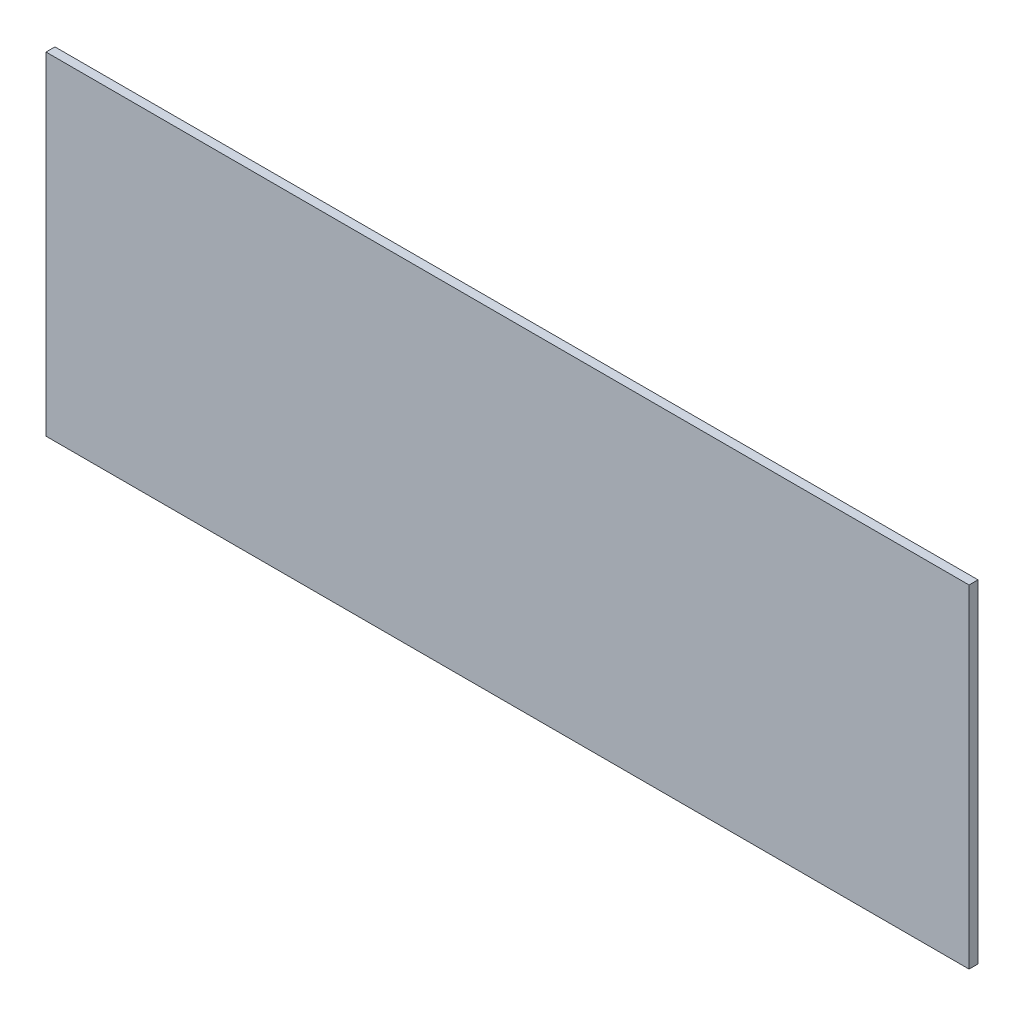
ISO-10303-21;
HEADER;
FILE_DESCRIPTION(('STEP AP214'),'2;1');
FILE_NAME('part.step','',(''),(''),'','','');
FILE_SCHEMA(('AUTOMOTIVE_DESIGN { 1 0 10303 214 1 1 1 1 }'));
ENDSEC;
DATA;
#1=APPLICATION_CONTEXT('core data for automotive mechanical design processes');
#2=APPLICATION_PROTOCOL_DEFINITION('international standard','automotive_design',2000,#1);
#3=PRODUCT_CONTEXT('',#1,'mechanical');
#4=PRODUCT('Part','Part','',(#3));
#5=PRODUCT_RELATED_PRODUCT_CATEGORY('part','',(#4));
#6=PRODUCT_DEFINITION_FORMATION('','',#4);
#7=PRODUCT_DEFINITION_CONTEXT('part definition',#1,'design');
#8=PRODUCT_DEFINITION('design','',#6,#7);
#9=PRODUCT_DEFINITION_SHAPE('','',#8);
#10=(LENGTH_UNIT() NAMED_UNIT(*) SI_UNIT(.MILLI.,.METRE.));
#11=(NAMED_UNIT(*) PLANE_ANGLE_UNIT() SI_UNIT($,.RADIAN.));
#12=(NAMED_UNIT(*) SI_UNIT($,.STERADIAN.) SOLID_ANGLE_UNIT());
#13=UNCERTAINTY_MEASURE_WITH_UNIT(LENGTH_MEASURE(1.E-05),#10,'distance_accuracy_value','');
#14=(GEOMETRIC_REPRESENTATION_CONTEXT(3) GLOBAL_UNCERTAINTY_ASSIGNED_CONTEXT((#13)) GLOBAL_UNIT_ASSIGNED_CONTEXT((#10,
#11,#12)) REPRESENTATION_CONTEXT('',''));
#15=CARTESIAN_POINT('',(0.,0.,0.));
#16=DIRECTION('',(0.,0.,1.));
#17=DIRECTION('',(1.,0.,0.));
#18=AXIS2_PLACEMENT_3D('',#15,#16,#17);
#19=CARTESIAN_POINT('',(520.000000000002,-85.8471343611766,3.));
#20=DIRECTION('',(-1.,0.,0.));
#21=DIRECTION('',(0.,0.,1.));
#22=AXIS2_PLACEMENT_3D('',#19,#20,#21);
#23=PLANE('',#22);
#24=DIRECTION('',(0.,1.,0.));
#25=VECTOR('',#24,1.);
#26=CARTESIAN_POINT('',(520.000000000002,-85.8471343611766,0.));
#27=LINE('',#26,#25);
#28=CARTESIAN_POINT('',(520.000000000002,-85.8471343611766,0.));
#29=VERTEX_POINT('',#28);
#30=CARTESIAN_POINT('',(520.000000000002,25.8895406963624,0.));
#31=VERTEX_POINT('',#30);
#32=EDGE_CURVE('E97',#29,#31,#27,.T.);
#33=ORIENTED_EDGE('',*,*,#32,.T.);
#34=DIRECTION('',(0.,0.,-1.));
#35=VECTOR('',#34,1.);
#36=CARTESIAN_POINT('',(520.000000000002,25.8895406963624,3.));
#37=LINE('',#36,#35);
#38=CARTESIAN_POINT('',(520.000000000002,25.8895406963624,3.));
#39=VERTEX_POINT('',#38);
#40=EDGE_CURVE('E11',#39,#31,#37,.T.);
#41=ORIENTED_EDGE('',*,*,#40,.F.);
#42=DIRECTION('',(0.,1.,0.));
#43=VECTOR('',#42,1.);
#44=CARTESIAN_POINT('',(520.000000000002,-85.8471343611766,3.));
#45=LINE('',#44,#43);
#46=CARTESIAN_POINT('',(520.000000000002,-85.8471343611766,3.));
#47=VERTEX_POINT('',#46);
#48=EDGE_CURVE('E85',#47,#39,#45,.T.);
#49=ORIENTED_EDGE('',*,*,#48,.F.);
#50=DIRECTION('',(0.,0.,-1.));
#51=VECTOR('',#50,1.);
#52=CARTESIAN_POINT('',(520.000000000002,-85.8471343611766,3.));
#53=LINE('',#52,#51);
#54=EDGE_CURVE('E93',#47,#29,#53,.T.);
#55=ORIENTED_EDGE('',*,*,#54,.T.);
#56=EDGE_LOOP('',(#33,#41,#49,#55));
#57=FACE_BOUND('',#56,.T.);
#58=ADVANCED_FACE('F34',(#57),#23,.F.);
#59=CARTESIAN_POINT('',(520.000000000002,25.8895406963624,3.));
#60=DIRECTION('',(0.,-1.,0.));
#61=DIRECTION('',(0.,0.,-1.));
#62=AXIS2_PLACEMENT_3D('',#59,#60,#61);
#63=PLANE('',#62);
#64=DIRECTION('',(-1.,0.,0.));
#65=VECTOR('',#64,1.);
#66=CARTESIAN_POINT('',(520.000000000002,25.8895406963624,0.));
#67=LINE('',#66,#65);
#68=CARTESIAN_POINT('',(210.,25.8895406963624,0.));
#69=VERTEX_POINT('',#68);
#70=EDGE_CURVE('E89',#31,#69,#67,.T.);
#71=ORIENTED_EDGE('',*,*,#70,.T.);
#72=DIRECTION('',(0.,0.,-1.));
#73=VECTOR('',#72,1.);
#74=CARTESIAN_POINT('',(210.,25.8895406963624,3.));
#75=LINE('',#74,#73);
#76=CARTESIAN_POINT('',(210.,25.8895406963624,3.));
#77=VERTEX_POINT('',#76);
#78=EDGE_CURVE('E42',#77,#69,#75,.T.);
#79=ORIENTED_EDGE('',*,*,#78,.F.);
#80=DIRECTION('',(-1.,0.,0.));
#81=VECTOR('',#80,1.);
#82=CARTESIAN_POINT('',(520.000000000002,25.8895406963624,3.));
#83=LINE('',#82,#81);
#84=EDGE_CURVE('E80',#39,#77,#83,.T.);
#85=ORIENTED_EDGE('',*,*,#84,.F.);
#86=ORIENTED_EDGE('',*,*,#40,.T.);
#87=EDGE_LOOP('',(#71,#79,#85,#86));
#88=FACE_BOUND('',#87,.T.);
#89=ADVANCED_FACE('F88',(#88),#63,.F.);
#90=CARTESIAN_POINT('',(210.,-85.8471343611767,3.));
#91=DIRECTION('',(1.,0.,0.));
#92=DIRECTION('',(0.,0.,-1.));
#93=AXIS2_PLACEMENT_3D('',#90,#91,#92);
#94=PLANE('',#93);
#95=DIRECTION('',(0.,-1.,0.));
#96=VECTOR('',#95,1.);
#97=CARTESIAN_POINT('',(210.,-85.8471343611767,0.));
#98=LINE('',#97,#96);
#99=CARTESIAN_POINT('',(210.,-85.8471343611767,0.));
#100=VERTEX_POINT('',#99);
#101=EDGE_CURVE('E67',#69,#100,#98,.T.);
#102=ORIENTED_EDGE('',*,*,#101,.T.);
#103=DIRECTION('',(0.,0.,-1.));
#104=VECTOR('',#103,1.);
#105=CARTESIAN_POINT('',(210.,-85.8471343611767,3.));
#106=LINE('',#105,#104);
#107=CARTESIAN_POINT('',(210.,-85.8471343611767,3.));
#108=VERTEX_POINT('',#107);
#109=EDGE_CURVE('E90',#108,#100,#106,.T.);
#110=ORIENTED_EDGE('',*,*,#109,.F.);
#111=DIRECTION('',(0.,-1.,0.));
#112=VECTOR('',#111,1.);
#113=CARTESIAN_POINT('',(210.,-85.8471343611767,3.));
#114=LINE('',#113,#112);
#115=EDGE_CURVE('E83',#77,#108,#114,.T.);
#116=ORIENTED_EDGE('',*,*,#115,.F.);
#117=ORIENTED_EDGE('',*,*,#78,.T.);
#118=EDGE_LOOP('',(#102,#110,#116,#117));
#119=FACE_BOUND('',#118,.T.);
#120=ADVANCED_FACE('F91',(#119),#94,.F.);
#121=CARTESIAN_POINT('',(520.000000000002,-85.8471343611766,3.));
#122=DIRECTION('',(0.,1.,0.));
#123=DIRECTION('',(-1.,0.,0.));
#124=AXIS2_PLACEMENT_3D('',#121,#122,#123);
#125=PLANE('',#124);
#126=DIRECTION('',(1.,0.,0.));
#127=VECTOR('',#126,1.);
#128=CARTESIAN_POINT('',(520.000000000002,-85.8471343611766,0.));
#129=LINE('',#128,#127);
#130=EDGE_CURVE('E73',#100,#29,#129,.T.);
#131=ORIENTED_EDGE('',*,*,#130,.T.);
#132=ORIENTED_EDGE('',*,*,#54,.F.);
#133=DIRECTION('',(1.,0.,0.));
#134=VECTOR('',#133,1.);
#135=CARTESIAN_POINT('',(520.000000000002,-85.8471343611766,3.));
#136=LINE('',#135,#134);
#137=EDGE_CURVE('E50',#108,#47,#136,.T.);
#138=ORIENTED_EDGE('',*,*,#137,.F.);
#139=ORIENTED_EDGE('',*,*,#109,.T.);
#140=EDGE_LOOP('',(#131,#132,#138,#139));
#141=FACE_BOUND('',#140,.T.);
#142=ADVANCED_FACE('F104',(#141),#125,.F.);
#143=CARTESIAN_POINT('',(0.,0.,3.));
#144=DIRECTION('',(0.,0.,1.));
#145=DIRECTION('',(1.,0.,0.));
#146=AXIS2_PLACEMENT_3D('',#143,#144,#145);
#147=PLANE('',#146);
#148=ORIENTED_EDGE('',*,*,#48,.T.);
#149=ORIENTED_EDGE('',*,*,#84,.T.);
#150=ORIENTED_EDGE('',*,*,#115,.T.);
#151=ORIENTED_EDGE('',*,*,#137,.T.);
#152=EDGE_LOOP('',(#148,#149,#150,#151));
#153=FACE_BOUND('',#152,.T.);
#154=ADVANCED_FACE('F81',(#153),#147,.T.);
#155=CARTESIAN_POINT('',(0.,0.,0.));
#156=DIRECTION('',(0.,0.,1.));
#157=DIRECTION('',(1.,0.,0.));
#158=AXIS2_PLACEMENT_3D('',#155,#156,#157);
#159=PLANE('',#158);
#160=ORIENTED_EDGE('',*,*,#32,.F.);
#161=ORIENTED_EDGE('',*,*,#130,.F.);
#162=ORIENTED_EDGE('',*,*,#101,.F.);
#163=ORIENTED_EDGE('',*,*,#70,.F.);
#164=EDGE_LOOP('',(#160,#161,#162,#163));
#165=FACE_BOUND('',#164,.T.);
#166=ADVANCED_FACE('F107',(#165),#159,.F.);
#167=CLOSED_SHELL('',(#58,#89,#120,#142,#154,#166));
#168=MANIFOLD_SOLID_BREP('B2',#167);
#169=ADVANCED_BREP_SHAPE_REPRESENTATION('',(#18,#168),#14);
#170=SHAPE_DEFINITION_REPRESENTATION(#9,#169);
ENDSEC;
END-ISO-10303-21;
